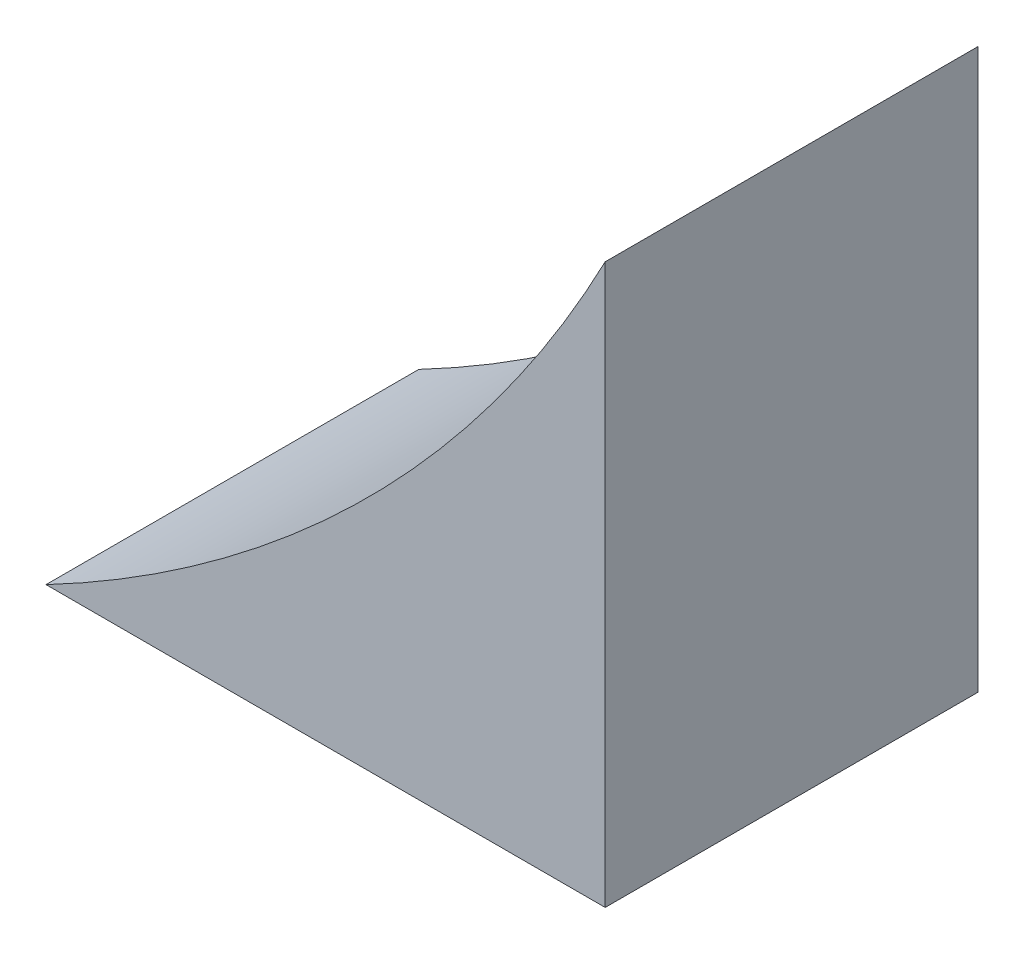
ISO-10303-21;
HEADER;
FILE_DESCRIPTION(('STEP AP214'),'2;1');
FILE_NAME('part.step','',(''),(''),'','','');
FILE_SCHEMA(('AUTOMOTIVE_DESIGN { 1 0 10303 214 1 1 1 1 }'));
ENDSEC;
DATA;
#1=APPLICATION_CONTEXT('core data for automotive mechanical design processes');
#2=APPLICATION_PROTOCOL_DEFINITION('international standard','automotive_design',2000,#1);
#3=PRODUCT_CONTEXT('',#1,'mechanical');
#4=PRODUCT('Part','Part','',(#3));
#5=PRODUCT_RELATED_PRODUCT_CATEGORY('part','',(#4));
#6=PRODUCT_DEFINITION_FORMATION('','',#4);
#7=PRODUCT_DEFINITION_CONTEXT('part definition',#1,'design');
#8=PRODUCT_DEFINITION('design','',#6,#7);
#9=PRODUCT_DEFINITION_SHAPE('','',#8);
#10=(LENGTH_UNIT() NAMED_UNIT(*) SI_UNIT(.MILLI.,.METRE.));
#11=(NAMED_UNIT(*) PLANE_ANGLE_UNIT() SI_UNIT($,.RADIAN.));
#12=(NAMED_UNIT(*) SI_UNIT($,.STERADIAN.) SOLID_ANGLE_UNIT());
#13=UNCERTAINTY_MEASURE_WITH_UNIT(LENGTH_MEASURE(1.E-05),#10,'distance_accuracy_value','');
#14=(GEOMETRIC_REPRESENTATION_CONTEXT(3) GLOBAL_UNCERTAINTY_ASSIGNED_CONTEXT((#13)) GLOBAL_UNIT_ASSIGNED_CONTEXT((#10,
#11,#12)) REPRESENTATION_CONTEXT('',''));
#15=CARTESIAN_POINT('',(0.,0.,0.));
#16=DIRECTION('',(0.,0.,1.));
#17=DIRECTION('',(1.,0.,0.));
#18=AXIS2_PLACEMENT_3D('',#15,#16,#17);
#19=CARTESIAN_POINT('',(0.,0.,100.));
#20=DIRECTION('',(0.,1.,0.));
#21=DIRECTION('',(0.,0.,1.));
#22=AXIS2_PLACEMENT_3D('',#19,#20,#21);
#23=PLANE('',#22);
#24=DIRECTION('',(1.,0.,0.));
#25=VECTOR('',#24,1.);
#26=CARTESIAN_POINT('',(0.,0.,0.));
#27=LINE('',#26,#25);
#28=CARTESIAN_POINT('',(0.,0.,0.));
#29=VERTEX_POINT('',#28);
#30=CARTESIAN_POINT('',(150.,0.,0.));
#31=VERTEX_POINT('',#30);
#32=EDGE_CURVE('E70',#29,#31,#27,.T.);
#33=ORIENTED_EDGE('',*,*,#32,.T.);
#34=DIRECTION('',(0.,0.,-1.));
#35=VECTOR('',#34,1.);
#36=CARTESIAN_POINT('',(150.,0.,100.));
#37=LINE('',#36,#35);
#38=CARTESIAN_POINT('',(150.,0.,100.));
#39=VERTEX_POINT('',#38);
#40=EDGE_CURVE('E82',#39,#31,#37,.T.);
#41=ORIENTED_EDGE('',*,*,#40,.F.);
#42=DIRECTION('',(1.,0.,0.));
#43=VECTOR('',#42,1.);
#44=CARTESIAN_POINT('',(0.,0.,100.));
#45=LINE('',#44,#43);
#46=CARTESIAN_POINT('',(0.,0.,100.));
#47=VERTEX_POINT('',#46);
#48=EDGE_CURVE('E59',#47,#39,#45,.T.);
#49=ORIENTED_EDGE('',*,*,#48,.F.);
#50=DIRECTION('',(0.,0.,-1.));
#51=VECTOR('',#50,1.);
#52=CARTESIAN_POINT('',(0.,0.,100.));
#53=LINE('',#52,#51);
#54=EDGE_CURVE('E52',#47,#29,#53,.T.);
#55=ORIENTED_EDGE('',*,*,#54,.T.);
#56=EDGE_LOOP('',(#33,#41,#49,#55));
#57=FACE_BOUND('',#56,.T.);
#58=ADVANCED_FACE('F43',(#57),#23,.F.);
#59=CARTESIAN_POINT('',(150.,0.,100.));
#60=DIRECTION('',(-1.,0.,0.));
#61=DIRECTION('',(0.,0.,1.));
#62=AXIS2_PLACEMENT_3D('',#59,#60,#61);
#63=PLANE('',#62);
#64=DIRECTION('',(0.,1.,0.));
#65=VECTOR('',#64,1.);
#66=CARTESIAN_POINT('',(150.,0.,0.));
#67=LINE('',#66,#65);
#68=CARTESIAN_POINT('',(150.,150.,0.));
#69=VERTEX_POINT('',#68);
#70=EDGE_CURVE('E90',#31,#69,#67,.T.);
#71=ORIENTED_EDGE('',*,*,#70,.T.);
#72=DIRECTION('',(0.,0.,-1.));
#73=VECTOR('',#72,1.);
#74=CARTESIAN_POINT('',(150.,150.,100.));
#75=LINE('',#74,#73);
#76=CARTESIAN_POINT('',(150.,150.,100.));
#77=VERTEX_POINT('',#76);
#78=EDGE_CURVE('E94',#77,#69,#75,.T.);
#79=ORIENTED_EDGE('',*,*,#78,.F.);
#80=DIRECTION('',(0.,1.,0.));
#81=VECTOR('',#80,1.);
#82=CARTESIAN_POINT('',(150.,0.,100.));
#83=LINE('',#82,#81);
#84=EDGE_CURVE('E85',#39,#77,#83,.T.);
#85=ORIENTED_EDGE('',*,*,#84,.F.);
#86=ORIENTED_EDGE('',*,*,#40,.T.);
#87=EDGE_LOOP('',(#71,#79,#85,#86));
#88=FACE_BOUND('',#87,.T.);
#89=ADVANCED_FACE('F106',(#88),#63,.F.);
#90=CARTESIAN_POINT('',(0.,0.,100.));
#91=DIRECTION('',(0.,0.,-1.));
#92=DIRECTION('',(-1.,0.,0.));
#93=AXIS2_PLACEMENT_3D('',#90,#91,#92);
#94=PLANE('',#93);
#95=ORIENTED_EDGE('',*,*,#84,.T.);
#96=CARTESIAN_POINT('',(-164.55688259785,314.55688259785,100.));
#97=DIRECTION('',(0.,0.,1.));
#98=DIRECTION('',(1.,0.,0.));
#99=AXIS2_PLACEMENT_3D('',#96,#97,#98);
#100=CIRCLE('',#99,355.);
#101=EDGE_CURVE('E78',#47,#77,#100,.T.);
#102=ORIENTED_EDGE('',*,*,#101,.F.);
#103=ORIENTED_EDGE('',*,*,#48,.T.);
#104=EDGE_LOOP('',(#95,#102,#103));
#105=FACE_BOUND('',#104,.T.);
#106=ADVANCED_FACE('F83',(#105),#94,.F.);
#107=CARTESIAN_POINT('',(0.,0.,0.));
#108=DIRECTION('',(0.,0.,-1.));
#109=DIRECTION('',(-1.,0.,0.));
#110=AXIS2_PLACEMENT_3D('',#107,#108,#109);
#111=PLANE('',#110);
#112=CARTESIAN_POINT('',(-164.55688259785,314.55688259785,0.));
#113=DIRECTION('',(0.,0.,-1.));
#114=DIRECTION('',(-1.,0.,0.));
#115=AXIS2_PLACEMENT_3D('',#112,#113,#114);
#116=CIRCLE('',#115,355.);
#117=EDGE_CURVE('E11',#69,#29,#116,.T.);
#118=ORIENTED_EDGE('',*,*,#117,.F.);
#119=ORIENTED_EDGE('',*,*,#70,.F.);
#120=ORIENTED_EDGE('',*,*,#32,.F.);
#121=EDGE_LOOP('',(#118,#119,#120));
#122=FACE_BOUND('',#121,.T.);
#123=ADVANCED_FACE('F108',(#122),#111,.T.);
#124=CARTESIAN_POINT('',(-164.55688259785,314.55688259785,-900.));
#125=DIRECTION('',(0.,0.,1.));
#126=DIRECTION('',(1.,0.,0.));
#127=AXIS2_PLACEMENT_3D('',#124,#125,#126);
#128=CYLINDRICAL_SURFACE('',#127,355.);
#129=ORIENTED_EDGE('',*,*,#101,.T.);
#130=ORIENTED_EDGE('',*,*,#78,.T.);
#131=ORIENTED_EDGE('',*,*,#117,.T.);
#132=ORIENTED_EDGE('',*,*,#54,.F.);
#133=EDGE_LOOP('',(#129,#130,#131,#132));
#134=FACE_BOUND('',#133,.T.);
#135=ADVANCED_FACE('F80',(#134),#128,.F.);
#136=CLOSED_SHELL('',(#58,#89,#106,#123,#135));
#137=MANIFOLD_SOLID_BREP('B2',#136);
#138=ADVANCED_BREP_SHAPE_REPRESENTATION('',(#18,#137),#14);
#139=SHAPE_DEFINITION_REPRESENTATION(#9,#138);
ENDSEC;
END-ISO-10303-21;
